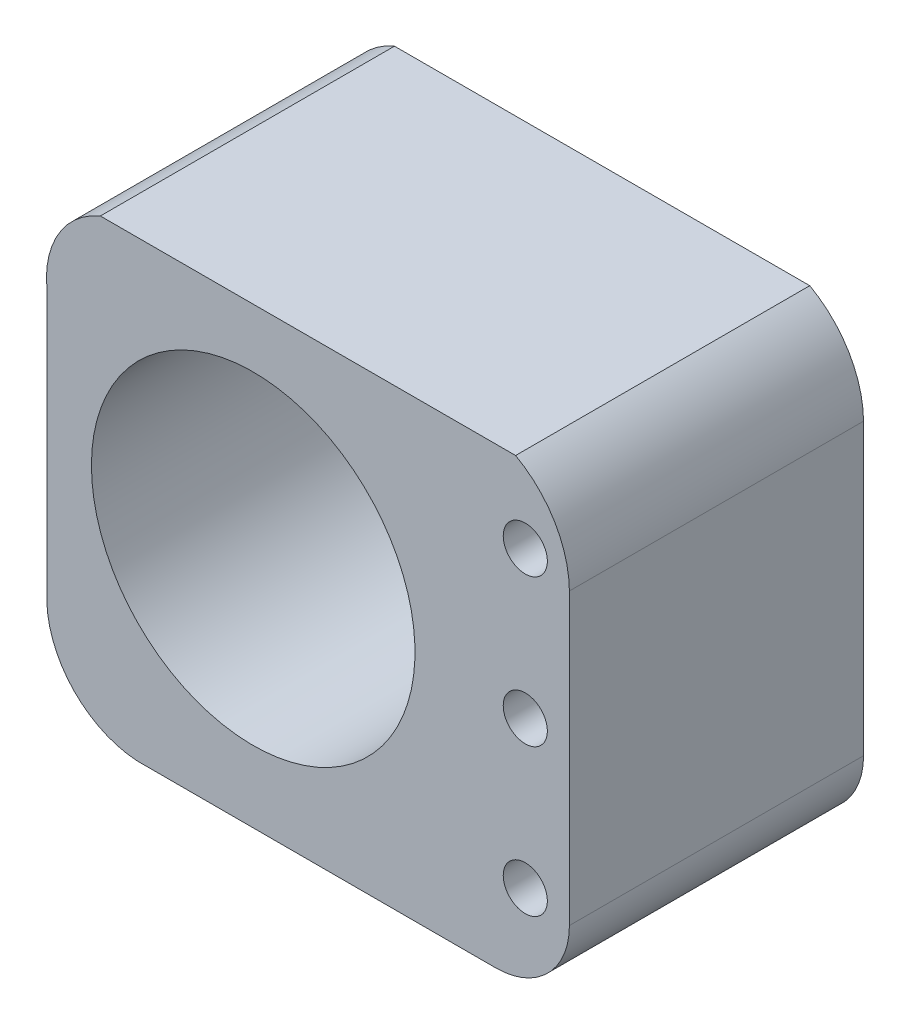
ISO-10303-21;
HEADER;
FILE_DESCRIPTION(('STEP AP214'),'2;1');
FILE_NAME('part.step','',(''),(''),'','','');
FILE_SCHEMA(('AUTOMOTIVE_DESIGN { 1 0 10303 214 1 1 1 1 }'));
ENDSEC;
DATA;
#1=APPLICATION_CONTEXT('core data for automotive mechanical design processes');
#2=APPLICATION_PROTOCOL_DEFINITION('international standard','automotive_design',2000,#1);
#3=PRODUCT_CONTEXT('',#1,'mechanical');
#4=PRODUCT('Part','Part','',(#3));
#5=PRODUCT_RELATED_PRODUCT_CATEGORY('part','',(#4));
#6=PRODUCT_DEFINITION_FORMATION('','',#4);
#7=PRODUCT_DEFINITION_CONTEXT('part definition',#1,'design');
#8=PRODUCT_DEFINITION('design','',#6,#7);
#9=PRODUCT_DEFINITION_SHAPE('','',#8);
#10=(LENGTH_UNIT() NAMED_UNIT(*) SI_UNIT(.MILLI.,.METRE.));
#11=(NAMED_UNIT(*) PLANE_ANGLE_UNIT() SI_UNIT($,.RADIAN.));
#12=(NAMED_UNIT(*) SI_UNIT($,.STERADIAN.) SOLID_ANGLE_UNIT());
#13=UNCERTAINTY_MEASURE_WITH_UNIT(LENGTH_MEASURE(1.E-05),#10,'distance_accuracy_value','');
#14=(GEOMETRIC_REPRESENTATION_CONTEXT(3) GLOBAL_UNCERTAINTY_ASSIGNED_CONTEXT((#13)) GLOBAL_UNIT_ASSIGNED_CONTEXT((#10,
#11,#12)) REPRESENTATION_CONTEXT('',''));
#15=CARTESIAN_POINT('',(0.,0.,0.));
#16=DIRECTION('',(0.,0.,1.));
#17=DIRECTION('',(1.,0.,0.));
#18=AXIS2_PLACEMENT_3D('',#15,#16,#17);
#19=CARTESIAN_POINT('',(44.3651270533409,-8.24504347763982,20.));
#20=DIRECTION('',(0.,0.,-1.));
#21=DIRECTION('',(-1.,0.,0.));
#22=AXIS2_PLACEMENT_3D('',#19,#20,#21);
#23=PLANE('',#22);
#24=CARTESIAN_POINT('',(44.3651270533409,-8.24504347763982,20.));
#25=DIRECTION('',(0.,0.,1.));
#26=DIRECTION('',(-1.,0.,0.));
#27=AXIS2_PLACEMENT_3D('',#24,#25,#26);
#28=CIRCLE('',#27,5.);
#29=CARTESIAN_POINT('',(44.3651270533408,-13.2450434776398,20.));
#30=VERTEX_POINT('',#29);
#31=CARTESIAN_POINT('',(49.3651270533409,-8.24504347763978,20.));
#32=VERTEX_POINT('',#31);
#33=EDGE_CURVE('E163',#30,#32,#28,.T.);
#34=ORIENTED_EDGE('',*,*,#33,.T.);
#35=DIRECTION('',(0.,1.,0.));
#36=VECTOR('',#35,1.);
#37=CARTESIAN_POINT('',(49.3651270533408,11.4549565223599,20.));
#38=LINE('',#37,#36);
#39=CARTESIAN_POINT('',(49.3651270533408,11.4549565223599,20.));
#40=VERTEX_POINT('',#39);
#41=EDGE_CURVE('E101',#32,#40,#38,.T.);
#42=ORIENTED_EDGE('',*,*,#41,.T.);
#43=CARTESIAN_POINT('',(42.2411113551246,11.3812181359524,20.));
#44=DIRECTION('',(0.,0.,1.));
#45=DIRECTION('',(-1.,0.,0.));
#46=AXIS2_PLACEMENT_3D('',#43,#44,#45);
#47=CIRCLE('',#46,7.12439730911057);
#48=CARTESIAN_POINT('',(45.7084038890214,17.6049565223601,20.));
#49=VERTEX_POINT('',#48);
#50=EDGE_CURVE('E187',#40,#49,#47,.T.);
#51=ORIENTED_EDGE('',*,*,#50,.T.);
#52=DIRECTION('',(-0.999999847992874,-0.000551374853476149,0.));
#53=VECTOR('',#52,1.);
#54=CARTESIAN_POINT('',(17.4708525648719,17.5893870442695,20.));
#55=LINE('',#54,#53);
#56=CARTESIAN_POINT('',(17.4708525648719,17.5893870442695,20.));
#57=VERTEX_POINT('',#56);
#58=EDGE_CURVE('E230',#49,#57,#55,.T.);
#59=ORIENTED_EDGE('',*,*,#58,.T.);
#60=CARTESIAN_POINT('',(19.7417395876245,12.1060732169365,20.));
#61=DIRECTION('',(0.,0.,1.));
#62=DIRECTION('',(-1.,0.,0.));
#63=AXIS2_PLACEMENT_3D('',#60,#61,#62);
#64=CIRCLE('',#63,5.93495226595192);
#65=CARTESIAN_POINT('',(13.8426120716971,11.45495652236,20.));
#66=VERTEX_POINT('',#65);
#67=EDGE_CURVE('E120',#57,#66,#64,.T.);
#68=ORIENTED_EDGE('',*,*,#67,.T.);
#69=DIRECTION('',(0.,-1.,0.));
#70=VECTOR('',#69,1.);
#71=CARTESIAN_POINT('',(13.8426120716971,11.45495652236,20.));
#72=LINE('',#71,#70);
#73=CARTESIAN_POINT('',(13.8426120716971,-6.24504347763984,20.));
#74=VERTEX_POINT('',#73);
#75=EDGE_CURVE('E114',#66,#74,#72,.T.);
#76=ORIENTED_EDGE('',*,*,#75,.T.);
#77=CARTESIAN_POINT('',(20.3887616713427,-6.69889387799433,20.));
#78=DIRECTION('',(0.,0.,1.));
#79=DIRECTION('',(1.,0.,0.));
#80=AXIS2_PLACEMENT_3D('',#77,#78,#79);
#81=CIRCLE('',#80,6.56186366567012);
#82=CARTESIAN_POINT('',(19.9349112709882,-13.2450434776399,20.));
#83=VERTEX_POINT('',#82);
#84=EDGE_CURVE('E118',#74,#83,#81,.T.);
#85=ORIENTED_EDGE('',*,*,#84,.T.);
#86=DIRECTION('',(1.,0.,0.));
#87=VECTOR('',#86,1.);
#88=CARTESIAN_POINT('',(19.9349112709882,-13.2450434776399,20.));
#89=LINE('',#88,#87);
#90=EDGE_CURVE('E58',#83,#30,#89,.T.);
#91=ORIENTED_EDGE('',*,*,#90,.T.);
#92=EDGE_LOOP('',(#34,#42,#51,#59,#68,#76,#85,#91));
#93=FACE_BOUND('',#92,.T.);
#94=CARTESIAN_POINT('',(46.3651270533406,-7.54504347763989,20.));
#95=DIRECTION('',(0.,0.,1.));
#96=DIRECTION('',(1.,0.,0.));
#97=AXIS2_PLACEMENT_3D('',#94,#95,#96);
#98=CIRCLE('',#97,1.5);
#99=CARTESIAN_POINT('',(44.8651270533406,-7.54504347763989,20.));
#100=VERTEX_POINT('',#99);
#101=EDGE_CURVE('E148',#100,#100,#98,.T.);
#102=ORIENTED_EDGE('',*,*,#101,.F.);
#103=EDGE_LOOP('',(#102));
#104=FACE_BOUND('',#103,.T.);
#105=CARTESIAN_POINT('',(27.8651270533409,2.60495652236008,20.));
#106=DIRECTION('',(0.,0.,1.));
#107=DIRECTION('',(1.,0.,0.));
#108=AXIS2_PLACEMENT_3D('',#105,#106,#107);
#109=CIRCLE('',#108,11.);
#110=CARTESIAN_POINT('',(16.8651270533409,2.60495652236008,20.));
#111=VERTEX_POINT('',#110);
#112=EDGE_CURVE('E214',#111,#111,#109,.T.);
#113=ORIENTED_EDGE('',*,*,#112,.F.);
#114=EDGE_LOOP('',(#113));
#115=FACE_BOUND('',#114,.T.);
#116=CARTESIAN_POINT('',(46.3651270533406,2.45495652235881,20.));
#117=DIRECTION('',(0.,0.,1.));
#118=DIRECTION('',(1.,0.,0.));
#119=AXIS2_PLACEMENT_3D('',#116,#117,#118);
#120=CIRCLE('',#119,1.5);
#121=CARTESIAN_POINT('',(44.8651270533406,2.45495652235881,20.));
#122=VERTEX_POINT('',#121);
#123=EDGE_CURVE('E215',#122,#122,#120,.T.);
#124=ORIENTED_EDGE('',*,*,#123,.F.);
#125=EDGE_LOOP('',(#124));
#126=FACE_BOUND('',#125,.T.);
#127=CARTESIAN_POINT('',(46.3651270533406,12.4549565223588,20.));
#128=DIRECTION('',(0.,0.,1.));
#129=DIRECTION('',(-1.,0.,0.));
#130=AXIS2_PLACEMENT_3D('',#127,#128,#129);
#131=CIRCLE('',#130,1.5);
#132=CARTESIAN_POINT('',(44.8651270533406,12.4549565223588,20.));
#133=VERTEX_POINT('',#132);
#134=EDGE_CURVE('E279',#133,#133,#131,.T.);
#135=ORIENTED_EDGE('',*,*,#134,.F.);
#136=EDGE_LOOP('',(#135));
#137=FACE_BOUND('',#136,.T.);
#138=ADVANCED_FACE('F40',(#93,#104,#115,#126,#137),#23,.F.);
#139=CARTESIAN_POINT('',(44.3651270533409,-8.24504347763982,0.));
#140=DIRECTION('',(0.,0.,-1.));
#141=DIRECTION('',(-1.,0.,0.));
#142=AXIS2_PLACEMENT_3D('',#139,#140,#141);
#143=PLANE('',#142);
#144=CARTESIAN_POINT('',(46.3651270533406,2.45495652235881,0.));
#145=DIRECTION('',(0.,0.,1.));
#146=DIRECTION('',(1.,0.,0.));
#147=AXIS2_PLACEMENT_3D('',#144,#145,#146);
#148=CIRCLE('',#147,1.5);
#149=CARTESIAN_POINT('',(44.8651270533406,2.45495652235881,0.));
#150=VERTEX_POINT('',#149);
#151=EDGE_CURVE('E286',#150,#150,#148,.T.);
#152=ORIENTED_EDGE('',*,*,#151,.T.);
#153=EDGE_LOOP('',(#152));
#154=FACE_BOUND('',#153,.T.);
#155=CARTESIAN_POINT('',(46.3651270533406,-7.54504347763989,0.));
#156=DIRECTION('',(0.,0.,1.));
#157=DIRECTION('',(1.,0.,0.));
#158=AXIS2_PLACEMENT_3D('',#155,#156,#157);
#159=CIRCLE('',#158,1.5);
#160=CARTESIAN_POINT('',(44.8651270533406,-7.54504347763989,0.));
#161=VERTEX_POINT('',#160);
#162=EDGE_CURVE('E219',#161,#161,#159,.T.);
#163=ORIENTED_EDGE('',*,*,#162,.T.);
#164=EDGE_LOOP('',(#163));
#165=FACE_BOUND('',#164,.T.);
#166=CARTESIAN_POINT('',(44.3651270533409,-8.24504347763982,0.));
#167=DIRECTION('',(0.,0.,1.));
#168=DIRECTION('',(-1.,0.,0.));
#169=AXIS2_PLACEMENT_3D('',#166,#167,#168);
#170=CIRCLE('',#169,5.);
#171=CARTESIAN_POINT('',(44.3651270533408,-13.2450434776398,0.));
#172=VERTEX_POINT('',#171);
#173=CARTESIAN_POINT('',(49.3651270533409,-8.24504347763978,0.));
#174=VERTEX_POINT('',#173);
#175=EDGE_CURVE('E142',#172,#174,#170,.T.);
#176=ORIENTED_EDGE('',*,*,#175,.F.);
#177=DIRECTION('',(1.,0.,0.));
#178=VECTOR('',#177,1.);
#179=CARTESIAN_POINT('',(19.9349112709882,-13.2450434776399,0.));
#180=LINE('',#179,#178);
#181=CARTESIAN_POINT('',(19.9349112709882,-13.2450434776399,0.));
#182=VERTEX_POINT('',#181);
#183=EDGE_CURVE('E93',#182,#172,#180,.T.);
#184=ORIENTED_EDGE('',*,*,#183,.F.);
#185=CARTESIAN_POINT('',(20.3887616713427,-6.69889387799433,0.));
#186=DIRECTION('',(0.,0.,1.));
#187=DIRECTION('',(1.,0.,0.));
#188=AXIS2_PLACEMENT_3D('',#185,#186,#187);
#189=CIRCLE('',#188,6.56186366567012);
#190=CARTESIAN_POINT('',(13.8426120716971,-6.24504347763984,0.));
#191=VERTEX_POINT('',#190);
#192=EDGE_CURVE('E87',#191,#182,#189,.T.);
#193=ORIENTED_EDGE('',*,*,#192,.F.);
#194=DIRECTION('',(0.,-1.,0.));
#195=VECTOR('',#194,1.);
#196=CARTESIAN_POINT('',(13.8426120716971,11.45495652236,0.));
#197=LINE('',#196,#195);
#198=CARTESIAN_POINT('',(13.8426120716971,11.45495652236,0.));
#199=VERTEX_POINT('',#198);
#200=EDGE_CURVE('E129',#199,#191,#197,.T.);
#201=ORIENTED_EDGE('',*,*,#200,.F.);
#202=CARTESIAN_POINT('',(19.7417395876245,12.1060732169365,0.));
#203=DIRECTION('',(0.,0.,1.));
#204=DIRECTION('',(-1.,0.,0.));
#205=AXIS2_PLACEMENT_3D('',#202,#203,#204);
#206=CIRCLE('',#205,5.93495226595192);
#207=CARTESIAN_POINT('',(17.4708525648719,17.5893870442695,0.));
#208=VERTEX_POINT('',#207);
#209=EDGE_CURVE('E198',#208,#199,#206,.T.);
#210=ORIENTED_EDGE('',*,*,#209,.F.);
#211=DIRECTION('',(-0.999999847992874,-0.000551374853476149,0.));
#212=VECTOR('',#211,1.);
#213=CARTESIAN_POINT('',(17.4708525648719,17.5893870442695,0.));
#214=LINE('',#213,#212);
#215=CARTESIAN_POINT('',(45.7084038890214,17.6049565223601,0.));
#216=VERTEX_POINT('',#215);
#217=EDGE_CURVE('E194',#216,#208,#214,.T.);
#218=ORIENTED_EDGE('',*,*,#217,.F.);
#219=CARTESIAN_POINT('',(42.2411113551246,11.3812181359524,0.));
#220=DIRECTION('',(0.,0.,1.));
#221=DIRECTION('',(-1.,0.,0.));
#222=AXIS2_PLACEMENT_3D('',#219,#220,#221);
#223=CIRCLE('',#222,7.12439730911057);
#224=CARTESIAN_POINT('',(49.3651270533408,11.4549565223599,0.));
#225=VERTEX_POINT('',#224);
#226=EDGE_CURVE('E186',#225,#216,#223,.T.);
#227=ORIENTED_EDGE('',*,*,#226,.F.);
#228=DIRECTION('',(0.,1.,0.));
#229=VECTOR('',#228,1.);
#230=CARTESIAN_POINT('',(49.3651270533408,11.4549565223599,0.));
#231=LINE('',#230,#229);
#232=EDGE_CURVE('E147',#174,#225,#231,.T.);
#233=ORIENTED_EDGE('',*,*,#232,.F.);
#234=EDGE_LOOP('',(#176,#184,#193,#201,#210,#218,#227,#233));
#235=FACE_BOUND('',#234,.T.);
#236=CARTESIAN_POINT('',(27.8651270533409,2.60495652236008,0.));
#237=DIRECTION('',(0.,0.,1.));
#238=DIRECTION('',(1.,0.,0.));
#239=AXIS2_PLACEMENT_3D('',#236,#237,#238);
#240=CIRCLE('',#239,11.);
#241=CARTESIAN_POINT('',(16.8651270533409,2.60495652236008,0.));
#242=VERTEX_POINT('',#241);
#243=EDGE_CURVE('E208',#242,#242,#240,.T.);
#244=ORIENTED_EDGE('',*,*,#243,.T.);
#245=EDGE_LOOP('',(#244));
#246=FACE_BOUND('',#245,.T.);
#247=CARTESIAN_POINT('',(46.3651270533406,12.4549565223588,0.));
#248=DIRECTION('',(0.,0.,1.));
#249=DIRECTION('',(-1.,0.,0.));
#250=AXIS2_PLACEMENT_3D('',#247,#248,#249);
#251=CIRCLE('',#250,1.5);
#252=CARTESIAN_POINT('',(44.8651270533406,12.4549565223588,0.));
#253=VERTEX_POINT('',#252);
#254=EDGE_CURVE('E282',#253,#253,#251,.T.);
#255=ORIENTED_EDGE('',*,*,#254,.T.);
#256=EDGE_LOOP('',(#255));
#257=FACE_BOUND('',#256,.T.);
#258=ADVANCED_FACE('F191',(#154,#165,#235,#246,#257),#143,.T.);
#259=CARTESIAN_POINT('',(44.3651270533409,-8.24504347763982,20.));
#260=DIRECTION('',(0.,0.,-1.));
#261=DIRECTION('',(-1.,0.,0.));
#262=AXIS2_PLACEMENT_3D('',#259,#260,#261);
#263=CYLINDRICAL_SURFACE('',#262,5.);
#264=ORIENTED_EDGE('',*,*,#175,.T.);
#265=DIRECTION('',(0.,0.,-1.));
#266=VECTOR('',#265,1.);
#267=CARTESIAN_POINT('',(49.3651270533409,-8.24504347763978,20.));
#268=LINE('',#267,#266);
#269=EDGE_CURVE('E12',#32,#174,#268,.T.);
#270=ORIENTED_EDGE('',*,*,#269,.F.);
#271=ORIENTED_EDGE('',*,*,#33,.F.);
#272=DIRECTION('',(0.,0.,-1.));
#273=VECTOR('',#272,1.);
#274=CARTESIAN_POINT('',(44.3651270533408,-13.2450434776398,20.));
#275=LINE('',#274,#273);
#276=EDGE_CURVE('E138',#30,#172,#275,.T.);
#277=ORIENTED_EDGE('',*,*,#276,.T.);
#278=EDGE_LOOP('',(#264,#270,#271,#277));
#279=FACE_BOUND('',#278,.T.);
#280=ADVANCED_FACE('F42',(#279),#263,.T.);
#281=CARTESIAN_POINT('',(49.3651270533408,11.4549565223599,20.));
#282=DIRECTION('',(-1.,0.,0.));
#283=DIRECTION('',(0.,-1.,0.));
#284=AXIS2_PLACEMENT_3D('',#281,#282,#283);
#285=PLANE('',#284);
#286=ORIENTED_EDGE('',*,*,#232,.T.);
#287=DIRECTION('',(0.,0.,-1.));
#288=VECTOR('',#287,1.);
#289=CARTESIAN_POINT('',(49.3651270533408,11.4549565223599,20.));
#290=LINE('',#289,#288);
#291=EDGE_CURVE('E50',#40,#225,#290,.T.);
#292=ORIENTED_EDGE('',*,*,#291,.F.);
#293=ORIENTED_EDGE('',*,*,#41,.F.);
#294=ORIENTED_EDGE('',*,*,#269,.T.);
#295=EDGE_LOOP('',(#286,#292,#293,#294));
#296=FACE_BOUND('',#295,.T.);
#297=ADVANCED_FACE('F366',(#296),#285,.F.);
#298=CARTESIAN_POINT('',(42.2411113551246,11.3812181359524,20.));
#299=DIRECTION('',(0.,0.,-1.));
#300=DIRECTION('',(-1.,0.,0.));
#301=AXIS2_PLACEMENT_3D('',#298,#299,#300);
#302=CYLINDRICAL_SURFACE('',#301,7.12439730911057);
#303=ORIENTED_EDGE('',*,*,#226,.T.);
#304=DIRECTION('',(0.,0.,-1.));
#305=VECTOR('',#304,1.);
#306=CARTESIAN_POINT('',(45.7084038890214,17.6049565223601,20.));
#307=LINE('',#306,#305);
#308=EDGE_CURVE('E176',#49,#216,#307,.T.);
#309=ORIENTED_EDGE('',*,*,#308,.F.);
#310=ORIENTED_EDGE('',*,*,#50,.F.);
#311=ORIENTED_EDGE('',*,*,#291,.T.);
#312=EDGE_LOOP('',(#303,#309,#310,#311));
#313=FACE_BOUND('',#312,.T.);
#314=ADVANCED_FACE('F184',(#313),#302,.T.);
#315=CARTESIAN_POINT('',(17.4708525648719,17.5893870442695,20.));
#316=DIRECTION('',(0.000551374853476149,-0.999999847992874,0.));
#317=DIRECTION('',(0.999999847992874,0.00055137485347615,0.));
#318=AXIS2_PLACEMENT_3D('',#315,#316,#317);
#319=PLANE('',#318);
#320=ORIENTED_EDGE('',*,*,#217,.T.);
#321=DIRECTION('',(0.,0.,-1.));
#322=VECTOR('',#321,1.);
#323=CARTESIAN_POINT('',(17.4708525648719,17.5893870442695,20.));
#324=LINE('',#323,#322);
#325=EDGE_CURVE('E172',#57,#208,#324,.T.);
#326=ORIENTED_EDGE('',*,*,#325,.F.);
#327=ORIENTED_EDGE('',*,*,#58,.F.);
#328=ORIENTED_EDGE('',*,*,#308,.T.);
#329=EDGE_LOOP('',(#320,#326,#327,#328));
#330=FACE_BOUND('',#329,.T.);
#331=ADVANCED_FACE('F348',(#330),#319,.F.);
#332=CARTESIAN_POINT('',(19.7417395876245,12.1060732169365,20.));
#333=DIRECTION('',(0.,0.,-1.));
#334=DIRECTION('',(-1.,0.,0.));
#335=AXIS2_PLACEMENT_3D('',#332,#333,#334);
#336=CYLINDRICAL_SURFACE('',#335,5.93495226595192);
#337=ORIENTED_EDGE('',*,*,#209,.T.);
#338=DIRECTION('',(0.,0.,-1.));
#339=VECTOR('',#338,1.);
#340=CARTESIAN_POINT('',(13.8426120716971,11.45495652236,20.));
#341=LINE('',#340,#339);
#342=EDGE_CURVE('E131',#66,#199,#341,.T.);
#343=ORIENTED_EDGE('',*,*,#342,.F.);
#344=ORIENTED_EDGE('',*,*,#67,.F.);
#345=ORIENTED_EDGE('',*,*,#325,.T.);
#346=EDGE_LOOP('',(#337,#343,#344,#345));
#347=FACE_BOUND('',#346,.T.);
#348=ADVANCED_FACE('F239',(#347),#336,.T.);
#349=CARTESIAN_POINT('',(13.8426120716971,11.45495652236,20.));
#350=DIRECTION('',(1.,0.,0.));
#351=DIRECTION('',(0.,0.,-1.));
#352=AXIS2_PLACEMENT_3D('',#349,#350,#351);
#353=PLANE('',#352);
#354=ORIENTED_EDGE('',*,*,#200,.T.);
#355=DIRECTION('',(0.,0.,-1.));
#356=VECTOR('',#355,1.);
#357=CARTESIAN_POINT('',(13.8426120716971,-6.24504347763984,20.));
#358=LINE('',#357,#356);
#359=EDGE_CURVE('E126',#74,#191,#358,.T.);
#360=ORIENTED_EDGE('',*,*,#359,.F.);
#361=ORIENTED_EDGE('',*,*,#75,.F.);
#362=ORIENTED_EDGE('',*,*,#342,.T.);
#363=EDGE_LOOP('',(#354,#360,#361,#362));
#364=FACE_BOUND('',#363,.T.);
#365=ADVANCED_FACE('F127',(#364),#353,.F.);
#366=CARTESIAN_POINT('',(20.3887616713427,-6.69889387799433,20.));
#367=DIRECTION('',(0.,0.,-1.));
#368=DIRECTION('',(-1.,0.,0.));
#369=AXIS2_PLACEMENT_3D('',#366,#367,#368);
#370=CYLINDRICAL_SURFACE('',#369,6.56186366567012);
#371=ORIENTED_EDGE('',*,*,#192,.T.);
#372=DIRECTION('',(0.,0.,-1.));
#373=VECTOR('',#372,1.);
#374=CARTESIAN_POINT('',(19.9349112709882,-13.2450434776399,20.));
#375=LINE('',#374,#373);
#376=EDGE_CURVE('E132',#83,#182,#375,.T.);
#377=ORIENTED_EDGE('',*,*,#376,.F.);
#378=ORIENTED_EDGE('',*,*,#84,.F.);
#379=ORIENTED_EDGE('',*,*,#359,.T.);
#380=EDGE_LOOP('',(#371,#377,#378,#379));
#381=FACE_BOUND('',#380,.T.);
#382=ADVANCED_FACE('F134',(#381),#370,.T.);
#383=CARTESIAN_POINT('',(19.9349112709882,-13.2450434776399,20.));
#384=DIRECTION('',(0.,1.,0.));
#385=DIRECTION('',(-1.,0.,0.));
#386=AXIS2_PLACEMENT_3D('',#383,#384,#385);
#387=PLANE('',#386);
#388=ORIENTED_EDGE('',*,*,#183,.T.);
#389=ORIENTED_EDGE('',*,*,#276,.F.);
#390=ORIENTED_EDGE('',*,*,#90,.F.);
#391=ORIENTED_EDGE('',*,*,#376,.T.);
#392=EDGE_LOOP('',(#388,#389,#390,#391));
#393=FACE_BOUND('',#392,.T.);
#394=ADVANCED_FACE('F244',(#393),#387,.F.);
#395=CARTESIAN_POINT('',(46.3651270533406,-7.54504347763989,20.));
#396=DIRECTION('',(0.,0.,-1.));
#397=DIRECTION('',(-1.,0.,0.));
#398=AXIS2_PLACEMENT_3D('',#395,#396,#397);
#399=CYLINDRICAL_SURFACE('',#398,1.5);
#400=CARTESIAN_POINT('',(44.8651270533406,-7.54504347763989,20.));
#401=CARTESIAN_POINT('',(44.8651270533406,-7.54504347763989,19.7916666666667));
#402=CARTESIAN_POINT('',(44.8651270533406,-7.54504347763989,19.5833333333333));
#403=CARTESIAN_POINT('',(44.8651270533406,-7.54504347763989,19.1666666666667));
#404=CARTESIAN_POINT('',(44.8651270533406,-7.54504347763989,18.9583333333333));
#405=CARTESIAN_POINT('',(44.8651270533406,-7.54504347763989,18.5416666666667));
#406=CARTESIAN_POINT('',(44.8651270533406,-7.54504347763989,18.3333333333333));
#407=CARTESIAN_POINT('',(44.8651270533406,-7.54504347763989,17.9166666666667));
#408=CARTESIAN_POINT('',(44.8651270533406,-7.54504347763989,17.7083333333333));
#409=CARTESIAN_POINT('',(44.8651270533406,-7.54504347763989,17.2916666666667));
#410=CARTESIAN_POINT('',(44.8651270533406,-7.54504347763989,17.0833333333333));
#411=CARTESIAN_POINT('',(44.8651270533406,-7.54504347763989,16.6666666666667));
#412=CARTESIAN_POINT('',(44.8651270533406,-7.54504347763989,16.4583333333333));
#413=CARTESIAN_POINT('',(44.8651270533406,-7.54504347763989,16.0416666666667));
#414=CARTESIAN_POINT('',(44.8651270533406,-7.54504347763989,15.8333333333333));
#415=CARTESIAN_POINT('',(44.8651270533406,-7.54504347763989,15.4166666666667));
#416=CARTESIAN_POINT('',(44.8651270533406,-7.54504347763989,15.2083333333333));
#417=CARTESIAN_POINT('',(44.8651270533406,-7.54504347763989,14.7916666666667));
#418=CARTESIAN_POINT('',(44.8651270533406,-7.54504347763989,14.5833333333333));
#419=CARTESIAN_POINT('',(44.8651270533406,-7.54504347763989,14.1666666666667));
#420=CARTESIAN_POINT('',(44.8651270533406,-7.54504347763989,13.9583333333333));
#421=CARTESIAN_POINT('',(44.8651270533406,-7.54504347763989,13.5416666666667));
#422=CARTESIAN_POINT('',(44.8651270533406,-7.54504347763989,13.3333333333333));
#423=CARTESIAN_POINT('',(44.8651270533406,-7.54504347763989,12.9166666666667));
#424=CARTESIAN_POINT('',(44.8651270533406,-7.54504347763989,12.7083333333333));
#425=CARTESIAN_POINT('',(44.8651270533406,-7.54504347763989,12.2916666666667));
#426=CARTESIAN_POINT('',(44.8651270533406,-7.54504347763989,12.0833333333333));
#427=CARTESIAN_POINT('',(44.8651270533406,-7.54504347763989,11.6666666666667));
#428=CARTESIAN_POINT('',(44.8651270533406,-7.54504347763989,11.4583333333333));
#429=CARTESIAN_POINT('',(44.8651270533406,-7.54504347763989,11.0416666666667));
#430=CARTESIAN_POINT('',(44.8651270533406,-7.54504347763989,10.8333333333333));
#431=CARTESIAN_POINT('',(44.8651270533406,-7.54504347763989,10.4166666666667));
#432=CARTESIAN_POINT('',(44.8651270533406,-7.54504347763989,10.2083333333333));
#433=CARTESIAN_POINT('',(44.8651270533406,-7.54504347763989,9.79166666666667));
#434=CARTESIAN_POINT('',(44.8651270533406,-7.54504347763989,9.58333333333333));
#435=CARTESIAN_POINT('',(44.8651270533406,-7.54504347763989,9.16666666666667));
#436=CARTESIAN_POINT('',(44.8651270533406,-7.54504347763989,8.95833333333333));
#437=CARTESIAN_POINT('',(44.8651270533406,-7.54504347763989,8.54166666666667));
#438=CARTESIAN_POINT('',(44.8651270533406,-7.54504347763989,8.33333333333333));
#439=CARTESIAN_POINT('',(44.8651270533406,-7.54504347763989,7.91666666666667));
#440=CARTESIAN_POINT('',(44.8651270533406,-7.54504347763989,7.70833333333333));
#441=CARTESIAN_POINT('',(44.8651270533406,-7.54504347763989,7.29166666666667));
#442=CARTESIAN_POINT('',(44.8651270533406,-7.54504347763989,7.08333333333333));
#443=CARTESIAN_POINT('',(44.8651270533406,-7.54504347763989,6.66666666666667));
#444=CARTESIAN_POINT('',(44.8651270533406,-7.54504347763989,6.45833333333333));
#445=CARTESIAN_POINT('',(44.8651270533406,-7.54504347763989,6.04166666666667));
#446=CARTESIAN_POINT('',(44.8651270533406,-7.54504347763989,5.83333333333333));
#447=CARTESIAN_POINT('',(44.8651270533406,-7.54504347763989,5.41666666666667));
#448=CARTESIAN_POINT('',(44.8651270533406,-7.54504347763989,5.20833333333333));
#449=CARTESIAN_POINT('',(44.8651270533406,-7.54504347763989,4.79166666666667));
#450=CARTESIAN_POINT('',(44.8651270533406,-7.54504347763989,4.58333333333334));
#451=CARTESIAN_POINT('',(44.8651270533406,-7.54504347763989,4.16666666666667));
#452=CARTESIAN_POINT('',(44.8651270533406,-7.54504347763989,3.95833333333334));
#453=CARTESIAN_POINT('',(44.8651270533406,-7.54504347763989,3.54166666666667));
#454=CARTESIAN_POINT('',(44.8651270533406,-7.54504347763989,3.33333333333334));
#455=CARTESIAN_POINT('',(44.8651270533406,-7.54504347763989,2.91666666666667));
#456=CARTESIAN_POINT('',(44.8651270533406,-7.54504347763989,2.70833333333334));
#457=CARTESIAN_POINT('',(44.8651270533406,-7.54504347763989,2.29166666666667));
#458=CARTESIAN_POINT('',(44.8651270533406,-7.54504347763989,2.08333333333334));
#459=CARTESIAN_POINT('',(44.8651270533406,-7.54504347763989,1.66666666666667));
#460=CARTESIAN_POINT('',(44.8651270533406,-7.54504347763989,1.45833333333333));
#461=CARTESIAN_POINT('',(44.8651270533406,-7.54504347763989,1.04166666666667));
#462=CARTESIAN_POINT('',(44.8651270533406,-7.54504347763989,0.833333333333334));
#463=CARTESIAN_POINT('',(44.8651270533406,-7.54504347763989,0.416666666666667));
#464=CARTESIAN_POINT('',(44.8651270533406,-7.54504347763989,0.208333333333334));
#465=CARTESIAN_POINT('',(44.8651270533406,-7.54504347763989,0.));
#466=B_SPLINE_CURVE_WITH_KNOTS('',3,(#400,#401,#402,#403,#404,#405,#406,#407,#408,#409,#410,
#411,#412,#413,#414,#415,#416,#417,#418,#419,#420,#421,#422,#423,#424,#425,#426,#427,#428,#429,
#430,#431,#432,#433,#434,#435,#436,#437,#438,#439,#440,#441,#442,#443,#444,#445,#446,#447,#448,
#449,#450,#451,#452,#453,#454,#455,#456,#457,#458,#459,#460,#461,#462,#463,#464,#465),
.UNSPECIFIED.,.F.,.F.,(4,2,2,2,2,2,2,2,2,2,2,2,2,2,2,2,2,2,2,2,2,2,2,2,2,2,2,2,2,2,2,2,4),(0.,
0.625000000000001,1.25,1.875,2.5,3.125,3.75,4.375,5.,5.62500000000001,6.25000000000001,6.875,
7.50000000000001,8.125,8.75,9.37500000000001,10.,10.625,11.25,11.875,12.5,13.125,13.75,14.375,
15.,15.625,16.25,16.875,17.5,18.125,18.75,19.375,20.),.UNSPECIFIED.);
#467=EDGE_CURVE('BSEAM246',#100,#161,#466,.T.);
#468=ORIENTED_EDGE('',*,*,#101,.T.);
#469=ORIENTED_EDGE('',*,*,#162,.F.);
#470=ORIENTED_EDGE('',*,*,#467,.T.);
#471=ORIENTED_EDGE('',*,*,#467,.F.);
#472=EDGE_LOOP('',(#468,#470,#469,#471));
#473=FACE_BOUND('',#472,.T.);
#474=ADVANCED_FACE('F246',(#473),#399,.F.);
#475=CARTESIAN_POINT('',(27.8651270533409,2.60495652236008,20.));
#476=DIRECTION('',(0.,0.,-1.));
#477=DIRECTION('',(-1.,0.,0.));
#478=AXIS2_PLACEMENT_3D('',#475,#476,#477);
#479=CYLINDRICAL_SURFACE('',#478,11.);
#480=CARTESIAN_POINT('',(16.8651270533409,2.60495652236008,20.));
#481=CARTESIAN_POINT('',(16.8651270533409,2.60495652236008,19.7916666666667));
#482=CARTESIAN_POINT('',(16.8651270533409,2.60495652236008,19.5833333333333));
#483=CARTESIAN_POINT('',(16.8651270533409,2.60495652236008,19.1666666666667));
#484=CARTESIAN_POINT('',(16.8651270533409,2.60495652236008,18.9583333333333));
#485=CARTESIAN_POINT('',(16.8651270533409,2.60495652236008,18.5416666666667));
#486=CARTESIAN_POINT('',(16.8651270533409,2.60495652236008,18.3333333333333));
#487=CARTESIAN_POINT('',(16.8651270533409,2.60495652236008,17.9166666666667));
#488=CARTESIAN_POINT('',(16.8651270533409,2.60495652236008,17.7083333333333));
#489=CARTESIAN_POINT('',(16.8651270533409,2.60495652236008,17.2916666666667));
#490=CARTESIAN_POINT('',(16.8651270533409,2.60495652236008,17.0833333333333));
#491=CARTESIAN_POINT('',(16.8651270533409,2.60495652236008,16.6666666666667));
#492=CARTESIAN_POINT('',(16.8651270533409,2.60495652236008,16.4583333333333));
#493=CARTESIAN_POINT('',(16.8651270533409,2.60495652236008,16.0416666666667));
#494=CARTESIAN_POINT('',(16.8651270533409,2.60495652236008,15.8333333333333));
#495=CARTESIAN_POINT('',(16.8651270533409,2.60495652236008,15.4166666666667));
#496=CARTESIAN_POINT('',(16.8651270533409,2.60495652236008,15.2083333333333));
#497=CARTESIAN_POINT('',(16.8651270533409,2.60495652236008,14.7916666666667));
#498=CARTESIAN_POINT('',(16.8651270533409,2.60495652236008,14.5833333333333));
#499=CARTESIAN_POINT('',(16.8651270533409,2.60495652236008,14.1666666666667));
#500=CARTESIAN_POINT('',(16.8651270533409,2.60495652236008,13.9583333333333));
#501=CARTESIAN_POINT('',(16.8651270533409,2.60495652236008,13.5416666666667));
#502=CARTESIAN_POINT('',(16.8651270533409,2.60495652236008,13.3333333333333));
#503=CARTESIAN_POINT('',(16.8651270533409,2.60495652236008,12.9166666666667));
#504=CARTESIAN_POINT('',(16.8651270533409,2.60495652236008,12.7083333333333));
#505=CARTESIAN_POINT('',(16.8651270533409,2.60495652236008,12.2916666666667));
#506=CARTESIAN_POINT('',(16.8651270533409,2.60495652236008,12.0833333333333));
#507=CARTESIAN_POINT('',(16.8651270533409,2.60495652236008,11.6666666666667));
#508=CARTESIAN_POINT('',(16.8651270533409,2.60495652236008,11.4583333333333));
#509=CARTESIAN_POINT('',(16.8651270533409,2.60495652236008,11.0416666666667));
#510=CARTESIAN_POINT('',(16.8651270533409,2.60495652236008,10.8333333333333));
#511=CARTESIAN_POINT('',(16.8651270533409,2.60495652236008,10.4166666666667));
#512=CARTESIAN_POINT('',(16.8651270533409,2.60495652236008,10.2083333333333));
#513=CARTESIAN_POINT('',(16.8651270533409,2.60495652236008,9.79166666666667));
#514=CARTESIAN_POINT('',(16.8651270533409,2.60495652236008,9.58333333333333));
#515=CARTESIAN_POINT('',(16.8651270533409,2.60495652236008,9.16666666666667));
#516=CARTESIAN_POINT('',(16.8651270533409,2.60495652236008,8.95833333333333));
#517=CARTESIAN_POINT('',(16.8651270533409,2.60495652236008,8.54166666666667));
#518=CARTESIAN_POINT('',(16.8651270533409,2.60495652236008,8.33333333333333));
#519=CARTESIAN_POINT('',(16.8651270533409,2.60495652236008,7.91666666666667));
#520=CARTESIAN_POINT('',(16.8651270533409,2.60495652236008,7.70833333333333));
#521=CARTESIAN_POINT('',(16.8651270533409,2.60495652236008,7.29166666666667));
#522=CARTESIAN_POINT('',(16.8651270533409,2.60495652236008,7.08333333333333));
#523=CARTESIAN_POINT('',(16.8651270533409,2.60495652236008,6.66666666666667));
#524=CARTESIAN_POINT('',(16.8651270533409,2.60495652236008,6.45833333333333));
#525=CARTESIAN_POINT('',(16.8651270533409,2.60495652236008,6.04166666666667));
#526=CARTESIAN_POINT('',(16.8651270533409,2.60495652236008,5.83333333333333));
#527=CARTESIAN_POINT('',(16.8651270533409,2.60495652236008,5.41666666666667));
#528=CARTESIAN_POINT('',(16.8651270533409,2.60495652236008,5.20833333333333));
#529=CARTESIAN_POINT('',(16.8651270533409,2.60495652236008,4.79166666666667));
#530=CARTESIAN_POINT('',(16.8651270533409,2.60495652236008,4.58333333333334));
#531=CARTESIAN_POINT('',(16.8651270533409,2.60495652236008,4.16666666666667));
#532=CARTESIAN_POINT('',(16.8651270533409,2.60495652236008,3.95833333333334));
#533=CARTESIAN_POINT('',(16.8651270533409,2.60495652236008,3.54166666666667));
#534=CARTESIAN_POINT('',(16.8651270533409,2.60495652236008,3.33333333333334));
#535=CARTESIAN_POINT('',(16.8651270533409,2.60495652236008,2.91666666666667));
#536=CARTESIAN_POINT('',(16.8651270533409,2.60495652236008,2.70833333333334));
#537=CARTESIAN_POINT('',(16.8651270533409,2.60495652236008,2.29166666666667));
#538=CARTESIAN_POINT('',(16.8651270533409,2.60495652236008,2.08333333333334));
#539=CARTESIAN_POINT('',(16.8651270533409,2.60495652236008,1.66666666666667));
#540=CARTESIAN_POINT('',(16.8651270533409,2.60495652236008,1.45833333333333));
#541=CARTESIAN_POINT('',(16.8651270533409,2.60495652236008,1.04166666666667));
#542=CARTESIAN_POINT('',(16.8651270533409,2.60495652236008,0.833333333333334));
#543=CARTESIAN_POINT('',(16.8651270533409,2.60495652236008,0.416666666666667));
#544=CARTESIAN_POINT('',(16.8651270533409,2.60495652236008,0.208333333333334));
#545=CARTESIAN_POINT('',(16.8651270533409,2.60495652236008,0.));
#546=B_SPLINE_CURVE_WITH_KNOTS('',3,(#480,#481,#482,#483,#484,#485,#486,#487,#488,#489,#490,
#491,#492,#493,#494,#495,#496,#497,#498,#499,#500,#501,#502,#503,#504,#505,#506,#507,#508,#509,
#510,#511,#512,#513,#514,#515,#516,#517,#518,#519,#520,#521,#522,#523,#524,#525,#526,#527,#528,
#529,#530,#531,#532,#533,#534,#535,#536,#537,#538,#539,#540,#541,#542,#543,#544,#545),
.UNSPECIFIED.,.F.,.F.,(4,2,2,2,2,2,2,2,2,2,2,2,2,2,2,2,2,2,2,2,2,2,2,2,2,2,2,2,2,2,2,2,4),(0.,
0.625000000000001,1.25,1.875,2.5,3.125,3.75,4.375,5.,5.62500000000001,6.25000000000001,6.875,
7.50000000000001,8.125,8.75,9.37500000000001,10.,10.625,11.25,11.875,12.5,13.125,13.75,14.375,
15.,15.625,16.25,16.875,17.5,18.125,18.75,19.375,20.),.UNSPECIFIED.);
#547=EDGE_CURVE('BSEAM252',#111,#242,#546,.T.);
#548=ORIENTED_EDGE('',*,*,#112,.T.);
#549=ORIENTED_EDGE('',*,*,#243,.F.);
#550=ORIENTED_EDGE('',*,*,#547,.T.);
#551=ORIENTED_EDGE('',*,*,#547,.F.);
#552=EDGE_LOOP('',(#548,#550,#549,#551));
#553=FACE_BOUND('',#552,.T.);
#554=ADVANCED_FACE('F252',(#553),#479,.F.);
#555=CARTESIAN_POINT('',(46.3651270533406,2.45495652235881,20.));
#556=DIRECTION('',(0.,0.,-1.));
#557=DIRECTION('',(-1.,0.,0.));
#558=AXIS2_PLACEMENT_3D('',#555,#556,#557);
#559=CYLINDRICAL_SURFACE('',#558,1.5);
#560=CARTESIAN_POINT('',(44.8651270533406,2.45495652235881,20.));
#561=CARTESIAN_POINT('',(44.8651270533406,2.45495652235881,19.7916666666667));
#562=CARTESIAN_POINT('',(44.8651270533406,2.45495652235881,19.5833333333333));
#563=CARTESIAN_POINT('',(44.8651270533406,2.45495652235881,19.1666666666667));
#564=CARTESIAN_POINT('',(44.8651270533406,2.45495652235881,18.9583333333333));
#565=CARTESIAN_POINT('',(44.8651270533406,2.45495652235881,18.5416666666667));
#566=CARTESIAN_POINT('',(44.8651270533406,2.45495652235881,18.3333333333333));
#567=CARTESIAN_POINT('',(44.8651270533406,2.45495652235881,17.9166666666667));
#568=CARTESIAN_POINT('',(44.8651270533406,2.45495652235881,17.7083333333333));
#569=CARTESIAN_POINT('',(44.8651270533406,2.45495652235881,17.2916666666667));
#570=CARTESIAN_POINT('',(44.8651270533406,2.45495652235881,17.0833333333333));
#571=CARTESIAN_POINT('',(44.8651270533406,2.45495652235881,16.6666666666667));
#572=CARTESIAN_POINT('',(44.8651270533406,2.45495652235881,16.4583333333333));
#573=CARTESIAN_POINT('',(44.8651270533406,2.45495652235881,16.0416666666667));
#574=CARTESIAN_POINT('',(44.8651270533406,2.45495652235881,15.8333333333333));
#575=CARTESIAN_POINT('',(44.8651270533406,2.45495652235881,15.4166666666667));
#576=CARTESIAN_POINT('',(44.8651270533406,2.45495652235881,15.2083333333333));
#577=CARTESIAN_POINT('',(44.8651270533406,2.45495652235881,14.7916666666667));
#578=CARTESIAN_POINT('',(44.8651270533406,2.45495652235881,14.5833333333333));
#579=CARTESIAN_POINT('',(44.8651270533406,2.45495652235881,14.1666666666667));
#580=CARTESIAN_POINT('',(44.8651270533406,2.45495652235881,13.9583333333333));
#581=CARTESIAN_POINT('',(44.8651270533406,2.45495652235881,13.5416666666667));
#582=CARTESIAN_POINT('',(44.8651270533406,2.45495652235881,13.3333333333333));
#583=CARTESIAN_POINT('',(44.8651270533406,2.45495652235881,12.9166666666667));
#584=CARTESIAN_POINT('',(44.8651270533406,2.45495652235881,12.7083333333333));
#585=CARTESIAN_POINT('',(44.8651270533406,2.45495652235881,12.2916666666667));
#586=CARTESIAN_POINT('',(44.8651270533406,2.45495652235881,12.0833333333333));
#587=CARTESIAN_POINT('',(44.8651270533406,2.45495652235881,11.6666666666667));
#588=CARTESIAN_POINT('',(44.8651270533406,2.45495652235881,11.4583333333333));
#589=CARTESIAN_POINT('',(44.8651270533406,2.45495652235881,11.0416666666667));
#590=CARTESIAN_POINT('',(44.8651270533406,2.45495652235881,10.8333333333333));
#591=CARTESIAN_POINT('',(44.8651270533406,2.45495652235881,10.4166666666667));
#592=CARTESIAN_POINT('',(44.8651270533406,2.45495652235881,10.2083333333333));
#593=CARTESIAN_POINT('',(44.8651270533406,2.45495652235881,9.79166666666667));
#594=CARTESIAN_POINT('',(44.8651270533406,2.45495652235881,9.58333333333333));
#595=CARTESIAN_POINT('',(44.8651270533406,2.45495652235881,9.16666666666667));
#596=CARTESIAN_POINT('',(44.8651270533406,2.45495652235881,8.95833333333333));
#597=CARTESIAN_POINT('',(44.8651270533406,2.45495652235881,8.54166666666667));
#598=CARTESIAN_POINT('',(44.8651270533406,2.45495652235881,8.33333333333333));
#599=CARTESIAN_POINT('',(44.8651270533406,2.45495652235881,7.91666666666667));
#600=CARTESIAN_POINT('',(44.8651270533406,2.45495652235881,7.70833333333333));
#601=CARTESIAN_POINT('',(44.8651270533406,2.45495652235881,7.29166666666667));
#602=CARTESIAN_POINT('',(44.8651270533406,2.45495652235881,7.08333333333333));
#603=CARTESIAN_POINT('',(44.8651270533406,2.45495652235881,6.66666666666667));
#604=CARTESIAN_POINT('',(44.8651270533406,2.45495652235881,6.45833333333333));
#605=CARTESIAN_POINT('',(44.8651270533406,2.45495652235881,6.04166666666667));
#606=CARTESIAN_POINT('',(44.8651270533406,2.45495652235881,5.83333333333333));
#607=CARTESIAN_POINT('',(44.8651270533406,2.45495652235881,5.41666666666667));
#608=CARTESIAN_POINT('',(44.8651270533406,2.45495652235881,5.20833333333333));
#609=CARTESIAN_POINT('',(44.8651270533406,2.45495652235881,4.79166666666667));
#610=CARTESIAN_POINT('',(44.8651270533406,2.45495652235881,4.58333333333334));
#611=CARTESIAN_POINT('',(44.8651270533406,2.45495652235881,4.16666666666667));
#612=CARTESIAN_POINT('',(44.8651270533406,2.45495652235881,3.95833333333334));
#613=CARTESIAN_POINT('',(44.8651270533406,2.45495652235881,3.54166666666667));
#614=CARTESIAN_POINT('',(44.8651270533406,2.45495652235881,3.33333333333334));
#615=CARTESIAN_POINT('',(44.8651270533406,2.45495652235881,2.91666666666667));
#616=CARTESIAN_POINT('',(44.8651270533406,2.45495652235881,2.70833333333334));
#617=CARTESIAN_POINT('',(44.8651270533406,2.45495652235881,2.29166666666667));
#618=CARTESIAN_POINT('',(44.8651270533406,2.45495652235881,2.08333333333334));
#619=CARTESIAN_POINT('',(44.8651270533406,2.45495652235881,1.66666666666667));
#620=CARTESIAN_POINT('',(44.8651270533406,2.45495652235881,1.45833333333333));
#621=CARTESIAN_POINT('',(44.8651270533406,2.45495652235881,1.04166666666667));
#622=CARTESIAN_POINT('',(44.8651270533406,2.45495652235881,0.833333333333334));
#623=CARTESIAN_POINT('',(44.8651270533406,2.45495652235881,0.416666666666667));
#624=CARTESIAN_POINT('',(44.8651270533406,2.45495652235881,0.208333333333334));
#625=CARTESIAN_POINT('',(44.8651270533406,2.45495652235881,0.));
#626=B_SPLINE_CURVE_WITH_KNOTS('',3,(#560,#561,#562,#563,#564,#565,#566,#567,#568,#569,#570,
#571,#572,#573,#574,#575,#576,#577,#578,#579,#580,#581,#582,#583,#584,#585,#586,#587,#588,#589,
#590,#591,#592,#593,#594,#595,#596,#597,#598,#599,#600,#601,#602,#603,#604,#605,#606,#607,#608,
#609,#610,#611,#612,#613,#614,#615,#616,#617,#618,#619,#620,#621,#622,#623,#624,#625),
.UNSPECIFIED.,.F.,.F.,(4,2,2,2,2,2,2,2,2,2,2,2,2,2,2,2,2,2,2,2,2,2,2,2,2,2,2,2,2,2,2,2,4),(0.,
0.625000000000001,1.25,1.875,2.5,3.125,3.75,4.375,5.,5.62500000000001,6.25000000000001,6.875,
7.50000000000001,8.125,8.75,9.37500000000001,10.,10.625,11.25,11.875,12.5,13.125,13.75,14.375,
15.,15.625,16.25,16.875,17.5,18.125,18.75,19.375,20.),.UNSPECIFIED.);
#627=EDGE_CURVE('BSEAM266',#122,#150,#626,.T.);
#628=ORIENTED_EDGE('',*,*,#123,.T.);
#629=ORIENTED_EDGE('',*,*,#151,.F.);
#630=ORIENTED_EDGE('',*,*,#627,.T.);
#631=ORIENTED_EDGE('',*,*,#627,.F.);
#632=EDGE_LOOP('',(#628,#630,#629,#631));
#633=FACE_BOUND('',#632,.T.);
#634=ADVANCED_FACE('F266',(#633),#559,.F.);
#635=CARTESIAN_POINT('',(46.3651270533406,12.4549565223588,20.));
#636=DIRECTION('',(0.,0.,-1.));
#637=DIRECTION('',(-1.,0.,0.));
#638=AXIS2_PLACEMENT_3D('',#635,#636,#637);
#639=CYLINDRICAL_SURFACE('',#638,1.5);
#640=CARTESIAN_POINT('',(44.8651270533406,12.4549565223588,20.));
#641=CARTESIAN_POINT('',(44.8651270533406,12.4549565223588,19.7916666666667));
#642=CARTESIAN_POINT('',(44.8651270533406,12.4549565223588,19.5833333333333));
#643=CARTESIAN_POINT('',(44.8651270533406,12.4549565223588,19.1666666666667));
#644=CARTESIAN_POINT('',(44.8651270533406,12.4549565223588,18.9583333333333));
#645=CARTESIAN_POINT('',(44.8651270533406,12.4549565223588,18.5416666666667));
#646=CARTESIAN_POINT('',(44.8651270533406,12.4549565223588,18.3333333333333));
#647=CARTESIAN_POINT('',(44.8651270533406,12.4549565223588,17.9166666666667));
#648=CARTESIAN_POINT('',(44.8651270533406,12.4549565223588,17.7083333333333));
#649=CARTESIAN_POINT('',(44.8651270533406,12.4549565223588,17.2916666666667));
#650=CARTESIAN_POINT('',(44.8651270533406,12.4549565223588,17.0833333333333));
#651=CARTESIAN_POINT('',(44.8651270533406,12.4549565223588,16.6666666666667));
#652=CARTESIAN_POINT('',(44.8651270533406,12.4549565223588,16.4583333333333));
#653=CARTESIAN_POINT('',(44.8651270533406,12.4549565223588,16.0416666666667));
#654=CARTESIAN_POINT('',(44.8651270533406,12.4549565223588,15.8333333333333));
#655=CARTESIAN_POINT('',(44.8651270533406,12.4549565223588,15.4166666666667));
#656=CARTESIAN_POINT('',(44.8651270533406,12.4549565223588,15.2083333333333));
#657=CARTESIAN_POINT('',(44.8651270533406,12.4549565223588,14.7916666666667));
#658=CARTESIAN_POINT('',(44.8651270533406,12.4549565223588,14.5833333333333));
#659=CARTESIAN_POINT('',(44.8651270533406,12.4549565223588,14.1666666666667));
#660=CARTESIAN_POINT('',(44.8651270533406,12.4549565223588,13.9583333333333));
#661=CARTESIAN_POINT('',(44.8651270533406,12.4549565223588,13.5416666666667));
#662=CARTESIAN_POINT('',(44.8651270533406,12.4549565223588,13.3333333333333));
#663=CARTESIAN_POINT('',(44.8651270533406,12.4549565223588,12.9166666666667));
#664=CARTESIAN_POINT('',(44.8651270533406,12.4549565223588,12.7083333333333));
#665=CARTESIAN_POINT('',(44.8651270533406,12.4549565223588,12.2916666666667));
#666=CARTESIAN_POINT('',(44.8651270533406,12.4549565223588,12.0833333333333));
#667=CARTESIAN_POINT('',(44.8651270533406,12.4549565223588,11.6666666666667));
#668=CARTESIAN_POINT('',(44.8651270533406,12.4549565223588,11.4583333333333));
#669=CARTESIAN_POINT('',(44.8651270533406,12.4549565223588,11.0416666666667));
#670=CARTESIAN_POINT('',(44.8651270533406,12.4549565223588,10.8333333333333));
#671=CARTESIAN_POINT('',(44.8651270533406,12.4549565223588,10.4166666666667));
#672=CARTESIAN_POINT('',(44.8651270533406,12.4549565223588,10.2083333333333));
#673=CARTESIAN_POINT('',(44.8651270533406,12.4549565223588,9.79166666666667));
#674=CARTESIAN_POINT('',(44.8651270533406,12.4549565223588,9.58333333333333));
#675=CARTESIAN_POINT('',(44.8651270533406,12.4549565223588,9.16666666666667));
#676=CARTESIAN_POINT('',(44.8651270533406,12.4549565223588,8.95833333333333));
#677=CARTESIAN_POINT('',(44.8651270533406,12.4549565223588,8.54166666666667));
#678=CARTESIAN_POINT('',(44.8651270533406,12.4549565223588,8.33333333333333));
#679=CARTESIAN_POINT('',(44.8651270533406,12.4549565223588,7.91666666666667));
#680=CARTESIAN_POINT('',(44.8651270533406,12.4549565223588,7.70833333333333));
#681=CARTESIAN_POINT('',(44.8651270533406,12.4549565223588,7.29166666666667));
#682=CARTESIAN_POINT('',(44.8651270533406,12.4549565223588,7.08333333333333));
#683=CARTESIAN_POINT('',(44.8651270533406,12.4549565223588,6.66666666666667));
#684=CARTESIAN_POINT('',(44.8651270533406,12.4549565223588,6.45833333333333));
#685=CARTESIAN_POINT('',(44.8651270533406,12.4549565223588,6.04166666666667));
#686=CARTESIAN_POINT('',(44.8651270533406,12.4549565223588,5.83333333333333));
#687=CARTESIAN_POINT('',(44.8651270533406,12.4549565223588,5.41666666666667));
#688=CARTESIAN_POINT('',(44.8651270533406,12.4549565223588,5.20833333333333));
#689=CARTESIAN_POINT('',(44.8651270533406,12.4549565223588,4.79166666666667));
#690=CARTESIAN_POINT('',(44.8651270533406,12.4549565223588,4.58333333333334));
#691=CARTESIAN_POINT('',(44.8651270533406,12.4549565223588,4.16666666666667));
#692=CARTESIAN_POINT('',(44.8651270533406,12.4549565223588,3.95833333333334));
#693=CARTESIAN_POINT('',(44.8651270533406,12.4549565223588,3.54166666666667));
#694=CARTESIAN_POINT('',(44.8651270533406,12.4549565223588,3.33333333333334));
#695=CARTESIAN_POINT('',(44.8651270533406,12.4549565223588,2.91666666666667));
#696=CARTESIAN_POINT('',(44.8651270533406,12.4549565223588,2.70833333333334));
#697=CARTESIAN_POINT('',(44.8651270533406,12.4549565223588,2.29166666666667));
#698=CARTESIAN_POINT('',(44.8651270533406,12.4549565223588,2.08333333333334));
#699=CARTESIAN_POINT('',(44.8651270533406,12.4549565223588,1.66666666666667));
#700=CARTESIAN_POINT('',(44.8651270533406,12.4549565223588,1.45833333333333));
#701=CARTESIAN_POINT('',(44.8651270533406,12.4549565223588,1.04166666666667));
#702=CARTESIAN_POINT('',(44.8651270533406,12.4549565223588,0.833333333333334));
#703=CARTESIAN_POINT('',(44.8651270533406,12.4549565223588,0.416666666666667));
#704=CARTESIAN_POINT('',(44.8651270533406,12.4549565223588,0.208333333333334));
#705=CARTESIAN_POINT('',(44.8651270533406,12.4549565223588,0.));
#706=B_SPLINE_CURVE_WITH_KNOTS('',3,(#640,#641,#642,#643,#644,#645,#646,#647,#648,#649,#650,
#651,#652,#653,#654,#655,#656,#657,#658,#659,#660,#661,#662,#663,#664,#665,#666,#667,#668,#669,
#670,#671,#672,#673,#674,#675,#676,#677,#678,#679,#680,#681,#682,#683,#684,#685,#686,#687,#688,
#689,#690,#691,#692,#693,#694,#695,#696,#697,#698,#699,#700,#701,#702,#703,#704,#705),
.UNSPECIFIED.,.F.,.F.,(4,2,2,2,2,2,2,2,2,2,2,2,2,2,2,2,2,2,2,2,2,2,2,2,2,2,2,2,2,2,2,2,4),(0.,
0.625000000000001,1.25,1.875,2.5,3.125,3.75,4.375,5.,5.62500000000001,6.25000000000001,6.875,
7.50000000000001,8.125,8.75,9.37500000000001,10.,10.625,11.25,11.875,12.5,13.125,13.75,14.375,
15.,15.625,16.25,16.875,17.5,18.125,18.75,19.375,20.),.UNSPECIFIED.);
#707=EDGE_CURVE('BSEAM270',#133,#253,#706,.T.);
#708=ORIENTED_EDGE('',*,*,#134,.T.);
#709=ORIENTED_EDGE('',*,*,#254,.F.);
#710=ORIENTED_EDGE('',*,*,#707,.T.);
#711=ORIENTED_EDGE('',*,*,#707,.F.);
#712=EDGE_LOOP('',(#708,#710,#709,#711));
#713=FACE_BOUND('',#712,.T.);
#714=ADVANCED_FACE('F270',(#713),#639,.F.);
#715=CLOSED_SHELL('',(#138,#258,#280,#297,#314,#331,#348,#365,#382,#394,#474,#554,#634,#714));
#716=MANIFOLD_SOLID_BREP('B2',#715);
#717=ADVANCED_BREP_SHAPE_REPRESENTATION('',(#18,#716),#14);
#718=SHAPE_DEFINITION_REPRESENTATION(#9,#717);
ENDSEC;
END-ISO-10303-21;
